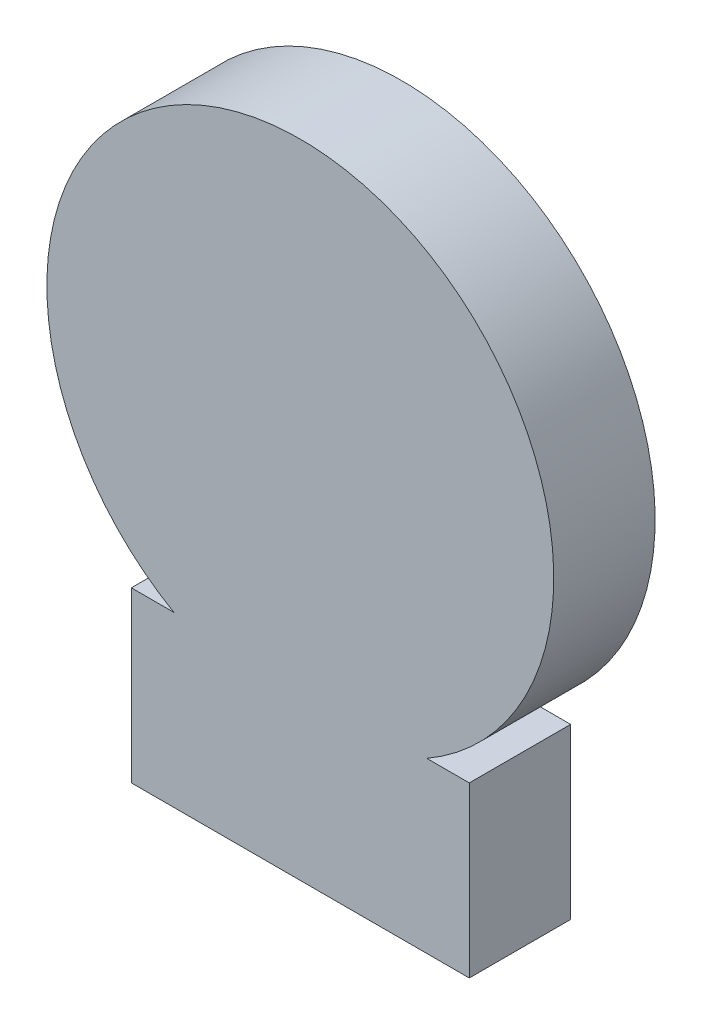
ISO-10303-21;
HEADER;
FILE_DESCRIPTION(('STEP AP214'),'2;1');
FILE_NAME('part.step','',(''),(''),'','','');
FILE_SCHEMA(('AUTOMOTIVE_DESIGN { 1 0 10303 214 1 1 1 1 }'));
ENDSEC;
DATA;
#1=APPLICATION_CONTEXT('core data for automotive mechanical design processes');
#2=APPLICATION_PROTOCOL_DEFINITION('international standard','automotive_design',2000,#1);
#3=PRODUCT_CONTEXT('',#1,'mechanical');
#4=PRODUCT('Part','Part','',(#3));
#5=PRODUCT_RELATED_PRODUCT_CATEGORY('part','',(#4));
#6=PRODUCT_DEFINITION_FORMATION('','',#4);
#7=PRODUCT_DEFINITION_CONTEXT('part definition',#1,'design');
#8=PRODUCT_DEFINITION('design','',#6,#7);
#9=PRODUCT_DEFINITION_SHAPE('','',#8);
#10=(LENGTH_UNIT() NAMED_UNIT(*) SI_UNIT(.MILLI.,.METRE.));
#11=(NAMED_UNIT(*) PLANE_ANGLE_UNIT() SI_UNIT($,.RADIAN.));
#12=(NAMED_UNIT(*) SI_UNIT($,.STERADIAN.) SOLID_ANGLE_UNIT());
#13=UNCERTAINTY_MEASURE_WITH_UNIT(LENGTH_MEASURE(1.E-05),#10,'distance_accuracy_value','');
#14=(GEOMETRIC_REPRESENTATION_CONTEXT(3) GLOBAL_UNCERTAINTY_ASSIGNED_CONTEXT((#13)) GLOBAL_UNIT_ASSIGNED_CONTEXT((#10,
#11,#12)) REPRESENTATION_CONTEXT('',''));
#15=CARTESIAN_POINT('',(0.,0.,0.));
#16=DIRECTION('',(0.,0.,1.));
#17=DIRECTION('',(1.,0.,0.));
#18=AXIS2_PLACEMENT_3D('',#15,#16,#17);
#19=CARTESIAN_POINT('',(10.,5.,6.));
#20=DIRECTION('',(0.,-1.,0.));
#21=DIRECTION('',(1.,0.,0.));
#22=AXIS2_PLACEMENT_3D('',#19,#20,#21);
#23=PLANE('',#22);
#24=DIRECTION('',(-1.,0.,0.));
#25=VECTOR('',#24,1.);
#26=CARTESIAN_POINT('',(10.,5.,0.));
#27=LINE('',#26,#25);
#28=CARTESIAN_POINT('',(10.,5.,0.));
#29=VERTEX_POINT('',#28);
#30=CARTESIAN_POINT('',(7.48331477354789,5.,0.));
#31=VERTEX_POINT('',#30);
#32=EDGE_CURVE('E107',#29,#31,#27,.T.);
#33=ORIENTED_EDGE('',*,*,#32,.T.);
#34=DIRECTION('',(0.,0.,1.));
#35=VECTOR('',#34,1.);
#36=CARTESIAN_POINT('',(7.48331477354789,5.,0.));
#37=LINE('',#36,#35);
#38=CARTESIAN_POINT('',(7.48331477354789,5.,6.));
#39=VERTEX_POINT('',#38);
#40=EDGE_CURVE('E96',#31,#39,#37,.T.);
#41=ORIENTED_EDGE('',*,*,#40,.T.);
#42=DIRECTION('',(-1.,0.,0.));
#43=VECTOR('',#42,1.);
#44=CARTESIAN_POINT('',(10.,5.,6.));
#45=LINE('',#44,#43);
#46=CARTESIAN_POINT('',(10.,5.,6.));
#47=VERTEX_POINT('',#46);
#48=EDGE_CURVE('E118',#47,#39,#45,.T.);
#49=ORIENTED_EDGE('',*,*,#48,.F.);
#50=DIRECTION('',(0.,0.,-1.));
#51=VECTOR('',#50,1.);
#52=CARTESIAN_POINT('',(10.,5.,6.));
#53=LINE('',#52,#51);
#54=EDGE_CURVE('E117',#47,#29,#53,.T.);
#55=ORIENTED_EDGE('',*,*,#54,.T.);
#56=EDGE_LOOP('',(#33,#41,#49,#55));
#57=FACE_BOUND('',#56,.T.);
#58=ADVANCED_FACE('F32',(#57),#23,.F.);
#59=CARTESIAN_POINT('',(-9.99999999999997,-5.00000000000001,6.));
#60=DIRECTION('',(1.,0.,0.));
#61=DIRECTION('',(0.,0.,-1.));
#62=AXIS2_PLACEMENT_3D('',#59,#60,#61);
#63=PLANE('',#62);
#64=DIRECTION('',(0.,-1.,0.));
#65=VECTOR('',#64,1.);
#66=CARTESIAN_POINT('',(-9.99999999999997,-5.00000000000001,0.));
#67=LINE('',#66,#65);
#68=CARTESIAN_POINT('',(-9.99999999999997,5.,0.));
#69=VERTEX_POINT('',#68);
#70=CARTESIAN_POINT('',(-9.99999999999997,-5.00000000000001,0.));
#71=VERTEX_POINT('',#70);
#72=EDGE_CURVE('E106',#69,#71,#67,.T.);
#73=ORIENTED_EDGE('',*,*,#72,.T.);
#74=DIRECTION('',(0.,0.,-1.));
#75=VECTOR('',#74,1.);
#76=CARTESIAN_POINT('',(-9.99999999999997,-5.00000000000001,6.));
#77=LINE('',#76,#75);
#78=CARTESIAN_POINT('',(-9.99999999999997,-5.00000000000001,6.));
#79=VERTEX_POINT('',#78);
#80=EDGE_CURVE('E11',#79,#71,#77,.T.);
#81=ORIENTED_EDGE('',*,*,#80,.F.);
#82=DIRECTION('',(0.,-1.,0.));
#83=VECTOR('',#82,1.);
#84=CARTESIAN_POINT('',(-9.99999999999997,-5.00000000000001,6.));
#85=LINE('',#84,#83);
#86=CARTESIAN_POINT('',(-9.99999999999997,5.,6.));
#87=VERTEX_POINT('',#86);
#88=EDGE_CURVE('E110',#87,#79,#85,.T.);
#89=ORIENTED_EDGE('',*,*,#88,.F.);
#90=DIRECTION('',(0.,0.,-1.));
#91=VECTOR('',#90,1.);
#92=CARTESIAN_POINT('',(-9.99999999999997,5.,6.));
#93=LINE('',#92,#91);
#94=EDGE_CURVE('E115',#87,#69,#93,.T.);
#95=ORIENTED_EDGE('',*,*,#94,.T.);
#96=EDGE_LOOP('',(#73,#81,#89,#95));
#97=FACE_BOUND('',#96,.T.);
#98=ADVANCED_FACE('F34',(#97),#63,.F.);
#99=CARTESIAN_POINT('',(10.,-5.00000000000001,6.));
#100=DIRECTION('',(0.,1.,0.));
#101=DIRECTION('',(-1.,0.,0.));
#102=AXIS2_PLACEMENT_3D('',#99,#100,#101);
#103=PLANE('',#102);
#104=DIRECTION('',(1.,0.,0.));
#105=VECTOR('',#104,1.);
#106=CARTESIAN_POINT('',(10.,-5.00000000000001,0.));
#107=LINE('',#106,#105);
#108=CARTESIAN_POINT('',(10.,-5.00000000000001,0.));
#109=VERTEX_POINT('',#108);
#110=EDGE_CURVE('E111',#71,#109,#107,.T.);
#111=ORIENTED_EDGE('',*,*,#110,.T.);
#112=DIRECTION('',(0.,0.,-1.));
#113=VECTOR('',#112,1.);
#114=CARTESIAN_POINT('',(10.,-5.00000000000001,6.));
#115=LINE('',#114,#113);
#116=CARTESIAN_POINT('',(10.,-5.00000000000001,6.));
#117=VERTEX_POINT('',#116);
#118=EDGE_CURVE('E40',#117,#109,#115,.T.);
#119=ORIENTED_EDGE('',*,*,#118,.F.);
#120=DIRECTION('',(1.,0.,0.));
#121=VECTOR('',#120,1.);
#122=CARTESIAN_POINT('',(10.,-5.00000000000001,6.));
#123=LINE('',#122,#121);
#124=EDGE_CURVE('E82',#79,#117,#123,.T.);
#125=ORIENTED_EDGE('',*,*,#124,.F.);
#126=ORIENTED_EDGE('',*,*,#80,.T.);
#127=EDGE_LOOP('',(#111,#119,#125,#126));
#128=FACE_BOUND('',#127,.T.);
#129=ADVANCED_FACE('F133',(#128),#103,.F.);
#130=CARTESIAN_POINT('',(10.,-5.00000000000001,6.));
#131=DIRECTION('',(-1.,0.,0.));
#132=DIRECTION('',(0.,0.,1.));
#133=AXIS2_PLACEMENT_3D('',#130,#131,#132);
#134=PLANE('',#133);
#135=DIRECTION('',(0.,1.,0.));
#136=VECTOR('',#135,1.);
#137=CARTESIAN_POINT('',(10.,-5.00000000000001,0.));
#138=LINE('',#137,#136);
#139=EDGE_CURVE('E108',#109,#29,#138,.T.);
#140=ORIENTED_EDGE('',*,*,#139,.T.);
#141=ORIENTED_EDGE('',*,*,#54,.F.);
#142=DIRECTION('',(0.,1.,0.));
#143=VECTOR('',#142,1.);
#144=CARTESIAN_POINT('',(10.,-5.00000000000001,6.));
#145=LINE('',#144,#143);
#146=EDGE_CURVE('E126',#117,#47,#145,.T.);
#147=ORIENTED_EDGE('',*,*,#146,.F.);
#148=ORIENTED_EDGE('',*,*,#118,.T.);
#149=EDGE_LOOP('',(#140,#141,#147,#148));
#150=FACE_BOUND('',#149,.T.);
#151=ADVANCED_FACE('F124',(#150),#134,.F.);
#152=CARTESIAN_POINT('',(-7.48331477354789,5.,6.));
#153=VERTEX_POINT('',#152);
#154=EDGE_CURVE('E53',#153,#87,#45,.T.);
#155=ORIENTED_EDGE('',*,*,#154,.F.);
#156=DIRECTION('',(0.,0.,1.));
#157=VECTOR('',#156,1.);
#158=CARTESIAN_POINT('',(-7.48331477354789,5.,0.));
#159=LINE('',#158,#157);
#160=CARTESIAN_POINT('',(-7.48331477354789,5.,0.));
#161=VERTEX_POINT('',#160);
#162=EDGE_CURVE('E94',#153,#161,#159,.F.);
#163=ORIENTED_EDGE('',*,*,#162,.T.);
#164=EDGE_CURVE('E75',#161,#69,#27,.T.);
#165=ORIENTED_EDGE('',*,*,#164,.T.);
#166=ORIENTED_EDGE('',*,*,#94,.F.);
#167=EDGE_LOOP('',(#155,#163,#165,#166));
#168=FACE_BOUND('',#167,.T.);
#169=ADVANCED_FACE('F101',(#168),#23,.F.);
#170=CARTESIAN_POINT('',(0.,0.,6.));
#171=DIRECTION('',(0.,0.,1.));
#172=DIRECTION('',(1.,0.,0.));
#173=AXIS2_PLACEMENT_3D('',#170,#171,#172);
#174=PLANE('',#173);
#175=ORIENTED_EDGE('',*,*,#48,.T.);
#176=CARTESIAN_POINT('',(0.,18.,6.));
#177=DIRECTION('',(0.,0.,1.));
#178=DIRECTION('',(1.,0.,0.));
#179=AXIS2_PLACEMENT_3D('',#176,#177,#178);
#180=CIRCLE('',#179,15.);
#181=EDGE_CURVE('E47',#39,#153,#180,.T.);
#182=ORIENTED_EDGE('',*,*,#181,.T.);
#183=ORIENTED_EDGE('',*,*,#154,.T.);
#184=ORIENTED_EDGE('',*,*,#88,.T.);
#185=ORIENTED_EDGE('',*,*,#124,.T.);
#186=ORIENTED_EDGE('',*,*,#146,.T.);
#187=EDGE_LOOP('',(#175,#182,#183,#184,#185,#186));
#188=FACE_BOUND('',#187,.T.);
#189=ADVANCED_FACE('F140',(#188),#174,.T.);
#190=CARTESIAN_POINT('',(0.,0.,0.));
#191=DIRECTION('',(0.,0.,1.));
#192=DIRECTION('',(1.,0.,0.));
#193=AXIS2_PLACEMENT_3D('',#190,#191,#192);
#194=PLANE('',#193);
#195=ORIENTED_EDGE('',*,*,#164,.F.);
#196=CARTESIAN_POINT('',(0.,18.,0.));
#197=DIRECTION('',(0.,0.,1.));
#198=DIRECTION('',(1.,0.,0.));
#199=AXIS2_PLACEMENT_3D('',#196,#197,#198);
#200=CIRCLE('',#199,15.);
#201=EDGE_CURVE('E92',#31,#161,#200,.T.);
#202=ORIENTED_EDGE('',*,*,#201,.F.);
#203=ORIENTED_EDGE('',*,*,#32,.F.);
#204=ORIENTED_EDGE('',*,*,#139,.F.);
#205=ORIENTED_EDGE('',*,*,#110,.F.);
#206=ORIENTED_EDGE('',*,*,#72,.F.);
#207=EDGE_LOOP('',(#195,#202,#203,#204,#205,#206));
#208=FACE_BOUND('',#207,.T.);
#209=ADVANCED_FACE('F104',(#208),#194,.F.);
#210=CARTESIAN_POINT('',(0.,18.,0.));
#211=DIRECTION('',(0.,0.,1.));
#212=DIRECTION('',(1.,0.,0.));
#213=AXIS2_PLACEMENT_3D('',#210,#211,#212);
#214=CYLINDRICAL_SURFACE('',#213,15.);
#215=ORIENTED_EDGE('',*,*,#40,.F.);
#216=ORIENTED_EDGE('',*,*,#201,.T.);
#217=ORIENTED_EDGE('',*,*,#162,.F.);
#218=ORIENTED_EDGE('',*,*,#181,.F.);
#219=EDGE_LOOP('',(#215,#216,#217,#218));
#220=FACE_BOUND('',#219,.T.);
#221=ADVANCED_FACE('F93',(#220),#214,.T.);
#222=CLOSED_SHELL('',(#58,#98,#129,#151,#169,#189,#209,#221));
#223=MANIFOLD_SOLID_BREP('B2',#222);
#224=ADVANCED_BREP_SHAPE_REPRESENTATION('',(#18,#223),#14);
#225=SHAPE_DEFINITION_REPRESENTATION(#9,#224);
ENDSEC;
END-ISO-10303-21;
